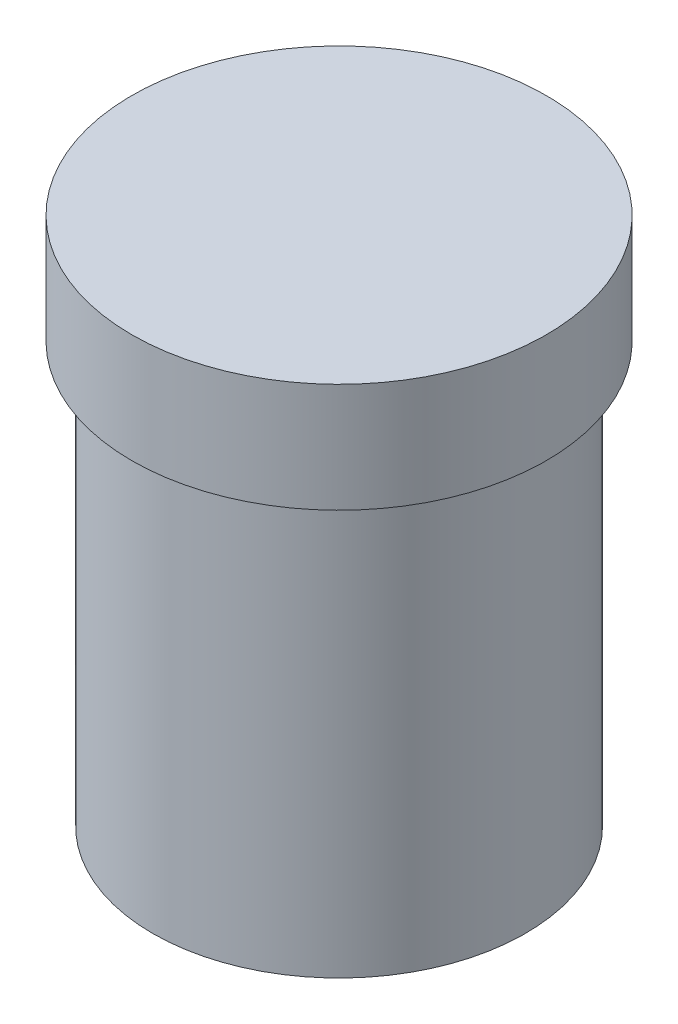
ISO-10303-21;
HEADER;
FILE_DESCRIPTION(('STEP AP214'),'2;1');
FILE_NAME('part.step','',(''),(''),'','','');
FILE_SCHEMA(('AUTOMOTIVE_DESIGN { 1 0 10303 214 1 1 1 1 }'));
ENDSEC;
DATA;
#1=APPLICATION_CONTEXT('core data for automotive mechanical design processes');
#2=APPLICATION_PROTOCOL_DEFINITION('international standard','automotive_design',2000,#1);
#3=PRODUCT_CONTEXT('',#1,'mechanical');
#4=PRODUCT('Part','Part','',(#3));
#5=PRODUCT_RELATED_PRODUCT_CATEGORY('part','',(#4));
#6=PRODUCT_DEFINITION_FORMATION('','',#4);
#7=PRODUCT_DEFINITION_CONTEXT('part definition',#1,'design');
#8=PRODUCT_DEFINITION('design','',#6,#7);
#9=PRODUCT_DEFINITION_SHAPE('','',#8);
#10=(LENGTH_UNIT() NAMED_UNIT(*) SI_UNIT(.MILLI.,.METRE.));
#11=(NAMED_UNIT(*) PLANE_ANGLE_UNIT() SI_UNIT($,.RADIAN.));
#12=(NAMED_UNIT(*) SI_UNIT($,.STERADIAN.) SOLID_ANGLE_UNIT());
#13=UNCERTAINTY_MEASURE_WITH_UNIT(LENGTH_MEASURE(1.E-05),#10,'distance_accuracy_value','');
#14=(GEOMETRIC_REPRESENTATION_CONTEXT(3) GLOBAL_UNCERTAINTY_ASSIGNED_CONTEXT((#13)) GLOBAL_UNIT_ASSIGNED_CONTEXT((#10,
#11,#12)) REPRESENTATION_CONTEXT('',''));
#15=CARTESIAN_POINT('',(0.,0.,0.));
#16=DIRECTION('',(0.,0.,1.));
#17=DIRECTION('',(1.,0.,0.));
#18=AXIS2_PLACEMENT_3D('',#15,#16,#17);
#19=CARTESIAN_POINT('',(0.,23.1,0.));
#20=DIRECTION('',(0.,-1.,0.));
#21=DIRECTION('',(0.,0.,-1.));
#22=AXIS2_PLACEMENT_3D('',#19,#20,#21);
#23=CYLINDRICAL_SURFACE('',#22,10.25);
#24=CARTESIAN_POINT('',(0.,23.1,0.));
#25=DIRECTION('',(0.,1.,0.));
#26=DIRECTION('',(0.,0.,1.));
#27=AXIS2_PLACEMENT_3D('',#24,#25,#26);
#28=CIRCLE('',#27,10.25);
#29=CARTESIAN_POINT('',(0.,23.1,10.25));
#30=VERTEX_POINT('',#29);
#31=EDGE_CURVE('E10',#30,#30,#28,.T.);
#32=ORIENTED_EDGE('',*,*,#31,.F.);
#33=EDGE_LOOP('',(#32));
#34=FACE_BOUND('',#33,.T.);
#35=CARTESIAN_POINT('',(0.,0.,0.));
#36=DIRECTION('',(0.,1.,0.));
#37=DIRECTION('',(0.,0.,1.));
#38=AXIS2_PLACEMENT_3D('',#35,#36,#37);
#39=CIRCLE('',#38,10.25);
#40=CARTESIAN_POINT('',(0.,0.,10.25));
#41=VERTEX_POINT('',#40);
#42=EDGE_CURVE('E34',#41,#41,#39,.T.);
#43=ORIENTED_EDGE('',*,*,#42,.T.);
#44=EDGE_LOOP('',(#43));
#45=FACE_BOUND('',#44,.T.);
#46=ADVANCED_FACE('F31',(#34,#45),#23,.T.);
#47=CARTESIAN_POINT('',(0.,0.,0.));
#48=DIRECTION('',(0.,1.,0.));
#49=DIRECTION('',(0.,0.,1.));
#50=AXIS2_PLACEMENT_3D('',#47,#48,#49);
#51=PLANE('',#50);
#52=ORIENTED_EDGE('',*,*,#42,.F.);
#53=EDGE_LOOP('',(#52));
#54=FACE_BOUND('',#53,.T.);
#55=ADVANCED_FACE('F54',(#54),#51,.F.);
#56=CARTESIAN_POINT('',(0.,29.1,0.));
#57=DIRECTION('',(0.,-1.,0.));
#58=DIRECTION('',(0.,0.,-1.));
#59=AXIS2_PLACEMENT_3D('',#56,#57,#58);
#60=CYLINDRICAL_SURFACE('',#59,11.4);
#61=CARTESIAN_POINT('',(0.,29.1,0.));
#62=DIRECTION('',(0.,1.,0.));
#63=DIRECTION('',(0.,0.,1.));
#64=AXIS2_PLACEMENT_3D('',#61,#62,#63);
#65=CIRCLE('',#64,11.4);
#66=CARTESIAN_POINT('',(0.,29.1,11.4));
#67=VERTEX_POINT('',#66);
#68=EDGE_CURVE('E41',#67,#67,#65,.T.);
#69=ORIENTED_EDGE('',*,*,#68,.F.);
#70=EDGE_LOOP('',(#69));
#71=FACE_BOUND('',#70,.T.);
#72=CARTESIAN_POINT('',(0.,23.1,0.));
#73=DIRECTION('',(0.,1.,0.));
#74=DIRECTION('',(0.,0.,1.));
#75=AXIS2_PLACEMENT_3D('',#72,#73,#74);
#76=CIRCLE('',#75,11.4);
#77=CARTESIAN_POINT('',(0.,23.1,11.4));
#78=VERTEX_POINT('',#77);
#79=EDGE_CURVE('E43',#78,#78,#76,.T.);
#80=ORIENTED_EDGE('',*,*,#79,.T.);
#81=EDGE_LOOP('',(#80));
#82=FACE_BOUND('',#81,.T.);
#83=ADVANCED_FACE('F51',(#71,#82),#60,.T.);
#84=CARTESIAN_POINT('',(0.,29.1,0.));
#85=DIRECTION('',(0.,1.,0.));
#86=DIRECTION('',(0.,0.,1.));
#87=AXIS2_PLACEMENT_3D('',#84,#85,#86);
#88=PLANE('',#87);
#89=ORIENTED_EDGE('',*,*,#68,.T.);
#90=EDGE_LOOP('',(#89));
#91=FACE_BOUND('',#90,.T.);
#92=ADVANCED_FACE('F49',(#91),#88,.T.);
#93=CARTESIAN_POINT('',(0.,23.1,0.));
#94=DIRECTION('',(0.,1.,0.));
#95=DIRECTION('',(0.,0.,1.));
#96=AXIS2_PLACEMENT_3D('',#93,#94,#95);
#97=PLANE('',#96);
#98=ORIENTED_EDGE('',*,*,#31,.T.);
#99=EDGE_LOOP('',(#98));
#100=FACE_BOUND('',#99,.T.);
#101=ORIENTED_EDGE('',*,*,#79,.F.);
#102=EDGE_LOOP('',(#101));
#103=FACE_BOUND('',#102,.T.);
#104=ADVANCED_FACE('F58',(#100,#103),#97,.F.);
#105=CLOSED_SHELL('',(#46,#55,#83,#92,#104));
#106=MANIFOLD_SOLID_BREP('B2',#105);
#107=ADVANCED_BREP_SHAPE_REPRESENTATION('',(#18,#106),#14);
#108=SHAPE_DEFINITION_REPRESENTATION(#9,#107);
ENDSEC;
END-ISO-10303-21;
